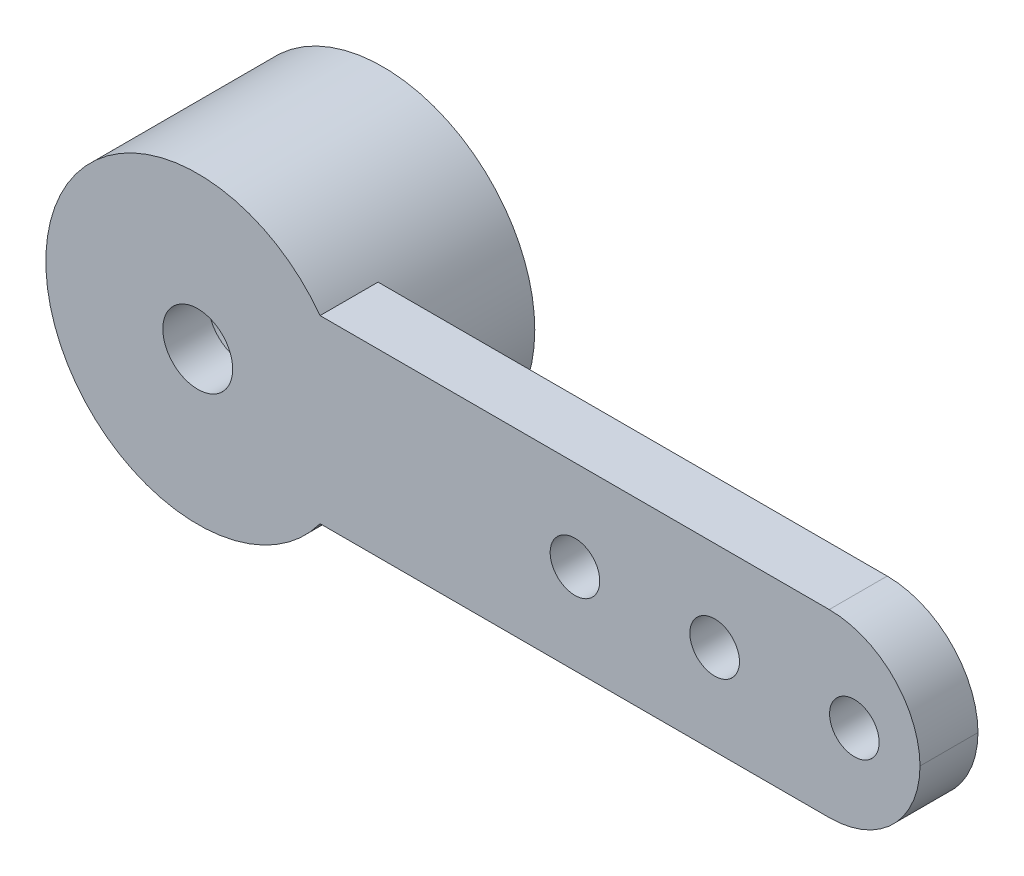
ISO-10303-21;
HEADER;
FILE_DESCRIPTION(('STEP AP214'),'2;1');
FILE_NAME('part.step','',(''),(''),'','','');
FILE_SCHEMA(('AUTOMOTIVE_DESIGN { 1 0 10303 214 1 1 1 1 }'));
ENDSEC;
DATA;
#1=APPLICATION_CONTEXT('core data for automotive mechanical design processes');
#2=APPLICATION_PROTOCOL_DEFINITION('international standard','automotive_design',2000,#1);
#3=PRODUCT_CONTEXT('',#1,'mechanical');
#4=PRODUCT('Part','Part','',(#3));
#5=PRODUCT_RELATED_PRODUCT_CATEGORY('part','',(#4));
#6=PRODUCT_DEFINITION_FORMATION('','',#4);
#7=PRODUCT_DEFINITION_CONTEXT('part definition',#1,'design');
#8=PRODUCT_DEFINITION('design','',#6,#7);
#9=PRODUCT_DEFINITION_SHAPE('','',#8);
#10=(LENGTH_UNIT() NAMED_UNIT(*) SI_UNIT(.MILLI.,.METRE.));
#11=(NAMED_UNIT(*) PLANE_ANGLE_UNIT() SI_UNIT($,.RADIAN.));
#12=(NAMED_UNIT(*) SI_UNIT($,.STERADIAN.) SOLID_ANGLE_UNIT());
#13=UNCERTAINTY_MEASURE_WITH_UNIT(LENGTH_MEASURE(1.E-05),#10,'distance_accuracy_value','');
#14=(GEOMETRIC_REPRESENTATION_CONTEXT(3) GLOBAL_UNCERTAINTY_ASSIGNED_CONTEXT((#13)) GLOBAL_UNIT_ASSIGNED_CONTEXT((#10,
#11,#12)) REPRESENTATION_CONTEXT('',''));
#15=CARTESIAN_POINT('',(0.,0.,0.));
#16=DIRECTION('',(0.,0.,1.));
#17=DIRECTION('',(1.,0.,0.));
#18=AXIS2_PLACEMENT_3D('',#15,#16,#17);
#19=CARTESIAN_POINT('',(0.,0.,3.3655));
#20=DIRECTION('',(0.,0.,-1.));
#21=DIRECTION('',(-1.,0.,0.));
#22=AXIS2_PLACEMENT_3D('',#19,#20,#21);
#23=CYLINDRICAL_SURFACE('',#22,2.76225);
#24=CARTESIAN_POINT('',(0.,0.,3.3655));
#25=DIRECTION('',(0.,0.,1.));
#26=DIRECTION('',(1.,0.,0.));
#27=AXIS2_PLACEMENT_3D('',#24,#25,#26);
#28=CIRCLE('',#27,2.76225);
#29=CARTESIAN_POINT('',(2.22396002043652,1.6383,3.3655));
#30=VERTEX_POINT('',#29);
#31=CARTESIAN_POINT('',(2.22396002043652,-1.6383,3.3655));
#32=VERTEX_POINT('',#31);
#33=EDGE_CURVE('E101',#30,#32,#28,.T.);
#34=ORIENTED_EDGE('',*,*,#33,.F.);
#35=DIRECTION('',(0.,0.,-1.));
#36=VECTOR('',#35,1.);
#37=CARTESIAN_POINT('',(2.22396002043652,1.6383,3.3655));
#38=LINE('',#37,#36);
#39=CARTESIAN_POINT('',(2.22396002043652,1.6383,2.3114));
#40=VERTEX_POINT('',#39);
#41=EDGE_CURVE('E104',#30,#40,#38,.T.);
#42=ORIENTED_EDGE('',*,*,#41,.T.);
#43=CARTESIAN_POINT('',(0.,0.,2.3114));
#44=DIRECTION('',(0.,0.,1.));
#45=DIRECTION('',(1.,0.,0.));
#46=AXIS2_PLACEMENT_3D('',#43,#44,#45);
#47=CIRCLE('',#46,2.76225);
#48=CARTESIAN_POINT('',(2.22396002043652,-1.6383,2.3114));
#49=VERTEX_POINT('',#48);
#50=EDGE_CURVE('E103',#49,#40,#47,.T.);
#51=ORIENTED_EDGE('',*,*,#50,.F.);
#52=DIRECTION('',(0.,0.,-1.));
#53=VECTOR('',#52,1.);
#54=CARTESIAN_POINT('',(2.22396002043652,-1.6383,3.3655));
#55=LINE('',#54,#53);
#56=EDGE_CURVE('E87',#49,#32,#55,.F.);
#57=ORIENTED_EDGE('',*,*,#56,.T.);
#58=EDGE_LOOP('',(#34,#42,#51,#57));
#59=FACE_BOUND('',#58,.T.);
#60=CARTESIAN_POINT('',(0.,0.,0.));
#61=DIRECTION('',(0.,0.,1.));
#62=DIRECTION('',(1.,0.,0.));
#63=AXIS2_PLACEMENT_3D('',#60,#61,#62);
#64=CIRCLE('',#63,2.76225);
#65=CARTESIAN_POINT('',(2.76225,0.,0.));
#66=VERTEX_POINT('',#65);
#67=EDGE_CURVE('E109',#66,#66,#64,.T.);
#68=ORIENTED_EDGE('',*,*,#67,.T.);
#69=EDGE_LOOP('',(#68));
#70=FACE_BOUND('',#69,.T.);
#71=ADVANCED_FACE('F35',(#59,#70),#23,.T.);
#72=CARTESIAN_POINT('',(0.,0.,3.3655));
#73=DIRECTION('',(0.,0.,1.));
#74=DIRECTION('',(1.,0.,0.));
#75=AXIS2_PLACEMENT_3D('',#72,#73,#74);
#76=PLANE('',#75);
#77=CARTESIAN_POINT('',(11.938,0.,3.3655));
#78=DIRECTION('',(0.,0.,1.));
#79=DIRECTION('',(1.,0.,0.));
#80=AXIS2_PLACEMENT_3D('',#77,#78,#79);
#81=CIRCLE('',#80,0.450849999999999);
#82=CARTESIAN_POINT('',(12.38885,0.,3.3655));
#83=VERTEX_POINT('',#82);
#84=EDGE_CURVE('E146',#83,#83,#81,.T.);
#85=ORIENTED_EDGE('',*,*,#84,.F.);
#86=EDGE_LOOP('',(#85));
#87=FACE_BOUND('',#86,.T.);
#88=CARTESIAN_POINT('',(9.398,0.,3.3655));
#89=DIRECTION('',(0.,0.,1.));
#90=DIRECTION('',(1.,0.,0.));
#91=AXIS2_PLACEMENT_3D('',#88,#89,#90);
#92=CIRCLE('',#91,0.450849999999999);
#93=CARTESIAN_POINT('',(9.84885,0.,3.3655));
#94=VERTEX_POINT('',#93);
#95=EDGE_CURVE('E136',#94,#94,#92,.T.);
#96=ORIENTED_EDGE('',*,*,#95,.F.);
#97=EDGE_LOOP('',(#96));
#98=FACE_BOUND('',#97,.T.);
#99=CARTESIAN_POINT('',(6.858,0.,3.3655));
#100=DIRECTION('',(0.,0.,1.));
#101=DIRECTION('',(1.,0.,0.));
#102=AXIS2_PLACEMENT_3D('',#99,#100,#101);
#103=CIRCLE('',#102,0.45085);
#104=CARTESIAN_POINT('',(7.30885,0.,3.3655));
#105=VERTEX_POINT('',#104);
#106=EDGE_CURVE('E133',#105,#105,#103,.T.);
#107=ORIENTED_EDGE('',*,*,#106,.F.);
#108=EDGE_LOOP('',(#107));
#109=FACE_BOUND('',#108,.T.);
#110=CARTESIAN_POINT('',(0.,0.,3.3655));
#111=DIRECTION('',(0.,0.,1.));
#112=DIRECTION('',(1.,0.,0.));
#113=AXIS2_PLACEMENT_3D('',#110,#111,#112);
#114=CIRCLE('',#113,0.635);
#115=CARTESIAN_POINT('',(0.635,0.,3.3655));
#116=VERTEX_POINT('',#115);
#117=EDGE_CURVE('E125',#116,#116,#114,.T.);
#118=ORIENTED_EDGE('',*,*,#117,.F.);
#119=EDGE_LOOP('',(#118));
#120=FACE_BOUND('',#119,.T.);
#121=DIRECTION('',(1.,0.,0.));
#122=VECTOR('',#121,1.);
#123=CARTESIAN_POINT('',(0.,-1.6383,3.3655));
#124=LINE('',#123,#122);
#125=CARTESIAN_POINT('',(11.4808,-1.6383,3.3655));
#126=VERTEX_POINT('',#125);
#127=EDGE_CURVE('E83',#32,#126,#124,.T.);
#128=ORIENTED_EDGE('',*,*,#127,.T.);
#129=CARTESIAN_POINT('',(11.4808,0.0126999999999998,3.3655));
#130=DIRECTION('',(0.,0.,1.));
#131=DIRECTION('',(1.,0.,0.));
#132=AXIS2_PLACEMENT_3D('',#129,#130,#131);
#133=CIRCLE('',#132,1.651);
#134=CARTESIAN_POINT('',(13.1317511531236,1.1276380220207E-13,3.3655));
#135=VERTEX_POINT('',#134);
#136=EDGE_CURVE('E119',#126,#135,#133,.T.);
#137=ORIENTED_EDGE('',*,*,#136,.T.);
#138=CARTESIAN_POINT('',(11.4808,-0.0126999999999998,3.3655));
#139=DIRECTION('',(0.,0.,1.));
#140=DIRECTION('',(1.,0.,0.));
#141=AXIS2_PLACEMENT_3D('',#138,#139,#140);
#142=CIRCLE('',#141,1.651);
#143=CARTESIAN_POINT('',(11.4808,1.6383,3.3655));
#144=VERTEX_POINT('',#143);
#145=EDGE_CURVE('E117',#135,#144,#142,.T.);
#146=ORIENTED_EDGE('',*,*,#145,.T.);
#147=DIRECTION('',(-1.,0.,0.));
#148=VECTOR('',#147,1.);
#149=CARTESIAN_POINT('',(0.,1.6383,3.3655));
#150=LINE('',#149,#148);
#151=EDGE_CURVE('E93',#144,#30,#150,.T.);
#152=ORIENTED_EDGE('',*,*,#151,.T.);
#153=ORIENTED_EDGE('',*,*,#33,.T.);
#154=EDGE_LOOP('',(#128,#137,#146,#152,#153));
#155=FACE_BOUND('',#154,.T.);
#156=ADVANCED_FACE('F107',(#87,#98,#109,#120,#155),#76,.T.);
#157=CARTESIAN_POINT('',(0.,0.,0.));
#158=DIRECTION('',(0.,0.,1.));
#159=DIRECTION('',(1.,0.,0.));
#160=AXIS2_PLACEMENT_3D('',#157,#158,#159);
#161=PLANE('',#160);
#162=CARTESIAN_POINT('',(0.,0.,0.));
#163=DIRECTION('',(0.,0.,-1.));
#164=DIRECTION('',(-1.,0.,0.));
#165=AXIS2_PLACEMENT_3D('',#162,#163,#164);
#166=CIRCLE('',#165,1.49225);
#167=CARTESIAN_POINT('',(-1.49225,0.,0.));
#168=VERTEX_POINT('',#167);
#169=EDGE_CURVE('E132',#168,#168,#166,.T.);
#170=ORIENTED_EDGE('',*,*,#169,.F.);
#171=EDGE_LOOP('',(#170));
#172=FACE_BOUND('',#171,.T.);
#173=ORIENTED_EDGE('',*,*,#67,.F.);
#174=EDGE_LOOP('',(#173));
#175=FACE_BOUND('',#174,.T.);
#176=ADVANCED_FACE('F177',(#172,#175),#161,.F.);
#177=CARTESIAN_POINT('',(0.,0.,2.3114));
#178=DIRECTION('',(0.,0.,1.));
#179=DIRECTION('',(1.,0.,0.));
#180=AXIS2_PLACEMENT_3D('',#177,#178,#179);
#181=PLANE('',#180);
#182=CARTESIAN_POINT('',(11.938,0.,2.3114));
#183=DIRECTION('',(0.,0.,1.));
#184=DIRECTION('',(1.,0.,0.));
#185=AXIS2_PLACEMENT_3D('',#182,#183,#184);
#186=CIRCLE('',#185,0.450849999999999);
#187=CARTESIAN_POINT('',(12.38885,0.,2.3114));
#188=VERTEX_POINT('',#187);
#189=EDGE_CURVE('E39',#188,#188,#186,.T.);
#190=ORIENTED_EDGE('',*,*,#189,.T.);
#191=EDGE_LOOP('',(#190));
#192=FACE_BOUND('',#191,.T.);
#193=CARTESIAN_POINT('',(9.398,0.,2.3114));
#194=DIRECTION('',(0.,0.,1.));
#195=DIRECTION('',(1.,0.,0.));
#196=AXIS2_PLACEMENT_3D('',#193,#194,#195);
#197=CIRCLE('',#196,0.450849999999999);
#198=CARTESIAN_POINT('',(9.84885,0.,2.3114));
#199=VERTEX_POINT('',#198);
#200=EDGE_CURVE('E134',#199,#199,#197,.T.);
#201=ORIENTED_EDGE('',*,*,#200,.T.);
#202=EDGE_LOOP('',(#201));
#203=FACE_BOUND('',#202,.T.);
#204=CARTESIAN_POINT('',(6.858,0.,2.3114));
#205=DIRECTION('',(0.,0.,1.));
#206=DIRECTION('',(1.,0.,0.));
#207=AXIS2_PLACEMENT_3D('',#204,#205,#206);
#208=CIRCLE('',#207,0.45085);
#209=CARTESIAN_POINT('',(7.30885,0.,2.3114));
#210=VERTEX_POINT('',#209);
#211=EDGE_CURVE('E130',#210,#210,#208,.T.);
#212=ORIENTED_EDGE('',*,*,#211,.T.);
#213=EDGE_LOOP('',(#212));
#214=FACE_BOUND('',#213,.T.);
#215=CARTESIAN_POINT('',(11.4808,-0.0126999999999998,2.3114));
#216=DIRECTION('',(0.,0.,1.));
#217=DIRECTION('',(1.,0.,0.));
#218=AXIS2_PLACEMENT_3D('',#215,#216,#217);
#219=CIRCLE('',#218,1.651);
#220=CARTESIAN_POINT('',(11.4808,1.6383,2.3114));
#221=VERTEX_POINT('',#220);
#222=CARTESIAN_POINT('',(13.1317511531236,1.1276380220207E-13,2.3114));
#223=VERTEX_POINT('',#222);
#224=EDGE_CURVE('E52',#221,#223,#219,.F.);
#225=ORIENTED_EDGE('',*,*,#224,.T.);
#226=CARTESIAN_POINT('',(11.4808,0.0126999999999998,2.3114));
#227=DIRECTION('',(0.,0.,1.));
#228=DIRECTION('',(1.,0.,0.));
#229=AXIS2_PLACEMENT_3D('',#226,#227,#228);
#230=CIRCLE('',#229,1.651);
#231=CARTESIAN_POINT('',(11.4808,-1.6383,2.3114));
#232=VERTEX_POINT('',#231);
#233=EDGE_CURVE('E44',#223,#232,#230,.F.);
#234=ORIENTED_EDGE('',*,*,#233,.T.);
#235=DIRECTION('',(1.,0.,0.));
#236=VECTOR('',#235,1.);
#237=CARTESIAN_POINT('',(0.,-1.6383,2.3114));
#238=LINE('',#237,#236);
#239=EDGE_CURVE('E155',#49,#232,#238,.T.);
#240=ORIENTED_EDGE('',*,*,#239,.F.);
#241=ORIENTED_EDGE('',*,*,#50,.T.);
#242=DIRECTION('',(-1.,0.,0.));
#243=VECTOR('',#242,1.);
#244=CARTESIAN_POINT('',(0.,1.6383,2.3114));
#245=LINE('',#244,#243);
#246=EDGE_CURVE('E105',#221,#40,#245,.T.);
#247=ORIENTED_EDGE('',*,*,#246,.F.);
#248=EDGE_LOOP('',(#225,#234,#240,#241,#247));
#249=FACE_BOUND('',#248,.T.);
#250=ADVANCED_FACE('F159',(#192,#203,#214,#249),#181,.F.);
#251=CARTESIAN_POINT('',(0.,1.6383,2.3114));
#252=DIRECTION('',(0.,1.,0.));
#253=DIRECTION('',(0.,0.,1.));
#254=AXIS2_PLACEMENT_3D('',#251,#252,#253);
#255=PLANE('',#254);
#256=ORIENTED_EDGE('',*,*,#151,.F.);
#257=DIRECTION('',(0.,0.,1.));
#258=VECTOR('',#257,1.);
#259=CARTESIAN_POINT('',(11.4808,1.6383,2.3114));
#260=LINE('',#259,#258);
#261=EDGE_CURVE('E12',#144,#221,#260,.F.);
#262=ORIENTED_EDGE('',*,*,#261,.T.);
#263=ORIENTED_EDGE('',*,*,#246,.T.);
#264=ORIENTED_EDGE('',*,*,#41,.F.);
#265=EDGE_LOOP('',(#256,#262,#263,#264));
#266=FACE_BOUND('',#265,.T.);
#267=ADVANCED_FACE('F158',(#266),#255,.T.);
#268=CARTESIAN_POINT('',(0.,-1.6383,2.3114));
#269=DIRECTION('',(0.,-1.,0.));
#270=DIRECTION('',(0.,0.,-1.));
#271=AXIS2_PLACEMENT_3D('',#268,#269,#270);
#272=PLANE('',#271);
#273=ORIENTED_EDGE('',*,*,#239,.T.);
#274=DIRECTION('',(0.,0.,1.));
#275=VECTOR('',#274,1.);
#276=CARTESIAN_POINT('',(11.4808,-1.6383,2.3114));
#277=LINE('',#276,#275);
#278=EDGE_CURVE('E90',#232,#126,#277,.T.);
#279=ORIENTED_EDGE('',*,*,#278,.T.);
#280=ORIENTED_EDGE('',*,*,#127,.F.);
#281=ORIENTED_EDGE('',*,*,#56,.F.);
#282=EDGE_LOOP('',(#273,#279,#280,#281));
#283=FACE_BOUND('',#282,.T.);
#284=ADVANCED_FACE('F86',(#283),#272,.T.);
#285=CARTESIAN_POINT('',(11.4808,-0.0126999999999998,2.3114));
#286=DIRECTION('',(0.,0.,1.));
#287=DIRECTION('',(1.,0.,0.));
#288=AXIS2_PLACEMENT_3D('',#285,#286,#287);
#289=CYLINDRICAL_SURFACE('',#288,1.651);
#290=DIRECTION('',(0.,0.,1.));
#291=VECTOR('',#290,1.);
#292=CARTESIAN_POINT('',(13.1317511531236,1.1276719033386E-13,2.83845));
#293=LINE('',#292,#291);
#294=EDGE_CURVE('E94',#223,#135,#293,.T.);
#295=ORIENTED_EDGE('',*,*,#294,.F.);
#296=ORIENTED_EDGE('',*,*,#224,.F.);
#297=ORIENTED_EDGE('',*,*,#261,.F.);
#298=ORIENTED_EDGE('',*,*,#145,.F.);
#299=EDGE_LOOP('',(#295,#296,#297,#298));
#300=FACE_BOUND('',#299,.T.);
#301=ADVANCED_FACE('F37',(#300),#289,.T.);
#302=CARTESIAN_POINT('',(11.4808,0.0126999999999998,2.3114));
#303=DIRECTION('',(0.,0.,1.));
#304=DIRECTION('',(1.,0.,0.));
#305=AXIS2_PLACEMENT_3D('',#302,#303,#304);
#306=CYLINDRICAL_SURFACE('',#305,1.651);
#307=ORIENTED_EDGE('',*,*,#233,.F.);
#308=ORIENTED_EDGE('',*,*,#294,.T.);
#309=ORIENTED_EDGE('',*,*,#136,.F.);
#310=ORIENTED_EDGE('',*,*,#278,.F.);
#311=EDGE_LOOP('',(#307,#308,#309,#310));
#312=FACE_BOUND('',#311,.T.);
#313=ADVANCED_FACE('F162',(#312),#306,.T.);
#314=CARTESIAN_POINT('',(0.,0.,-1.79605122421383));
#315=DIRECTION('',(0.,0.,1.));
#316=DIRECTION('',(1.,0.,0.));
#317=AXIS2_PLACEMENT_3D('',#314,#315,#316);
#318=CYLINDRICAL_SURFACE('',#317,0.635);
#319=CARTESIAN_POINT('',(0.,0.,2.54));
#320=DIRECTION('',(0.,0.,1.));
#321=DIRECTION('',(1.,0.,0.));
#322=AXIS2_PLACEMENT_3D('',#319,#320,#321);
#323=CIRCLE('',#322,0.635);
#324=CARTESIAN_POINT('',(0.635,0.,2.54));
#325=VERTEX_POINT('',#324);
#326=EDGE_CURVE('E126',#325,#325,#323,.F.);
#327=ORIENTED_EDGE('',*,*,#326,.T.);
#328=EDGE_LOOP('',(#327));
#329=FACE_BOUND('',#328,.T.);
#330=ORIENTED_EDGE('',*,*,#117,.T.);
#331=EDGE_LOOP('',(#330));
#332=FACE_BOUND('',#331,.T.);
#333=ADVANCED_FACE('F170',(#329,#332),#318,.F.);
#334=CARTESIAN_POINT('',(0.,0.,2.54));
#335=DIRECTION('',(0.,0.,1.));
#336=DIRECTION('',(1.,0.,0.));
#337=AXIS2_PLACEMENT_3D('',#334,#335,#336);
#338=PLANE('',#337);
#339=CARTESIAN_POINT('',(0.,0.,2.54));
#340=DIRECTION('',(0.,0.,1.));
#341=DIRECTION('',(1.,0.,0.));
#342=AXIS2_PLACEMENT_3D('',#339,#340,#341);
#343=CIRCLE('',#342,1.49225);
#344=CARTESIAN_POINT('',(1.49225,0.,2.54));
#345=VERTEX_POINT('',#344);
#346=EDGE_CURVE('E129',#345,#345,#343,.F.);
#347=ORIENTED_EDGE('',*,*,#346,.T.);
#348=EDGE_LOOP('',(#347));
#349=FACE_BOUND('',#348,.T.);
#350=ORIENTED_EDGE('',*,*,#326,.F.);
#351=EDGE_LOOP('',(#350));
#352=FACE_BOUND('',#351,.T.);
#353=ADVANCED_FACE('F191',(#349,#352),#338,.F.);
#354=CARTESIAN_POINT('',(0.,0.,9.3007203769025));
#355=DIRECTION('',(0.,0.,-1.));
#356=DIRECTION('',(-1.,0.,0.));
#357=AXIS2_PLACEMENT_3D('',#354,#355,#356);
#358=CYLINDRICAL_SURFACE('',#357,1.49225);
#359=ORIENTED_EDGE('',*,*,#169,.T.);
#360=EDGE_LOOP('',(#359));
#361=FACE_BOUND('',#360,.T.);
#362=ORIENTED_EDGE('',*,*,#346,.F.);
#363=EDGE_LOOP('',(#362));
#364=FACE_BOUND('',#363,.T.);
#365=ADVANCED_FACE('F195',(#361,#364),#358,.F.);
#366=CARTESIAN_POINT('',(6.858,0.,0.));
#367=DIRECTION('',(0.,0.,1.));
#368=DIRECTION('',(1.,0.,0.));
#369=AXIS2_PLACEMENT_3D('',#366,#367,#368);
#370=CYLINDRICAL_SURFACE('',#369,0.45085);
#371=ORIENTED_EDGE('',*,*,#106,.T.);
#372=EDGE_LOOP('',(#371));
#373=FACE_BOUND('',#372,.T.);
#374=ORIENTED_EDGE('',*,*,#211,.F.);
#375=EDGE_LOOP('',(#374));
#376=FACE_BOUND('',#375,.T.);
#377=ADVANCED_FACE('F199',(#373,#376),#370,.F.);
#378=CARTESIAN_POINT('',(9.398,0.,0.));
#379=DIRECTION('',(0.,0.,1.));
#380=DIRECTION('',(1.,0.,0.));
#381=AXIS2_PLACEMENT_3D('',#378,#379,#380);
#382=CYLINDRICAL_SURFACE('',#381,0.450849999999999);
#383=ORIENTED_EDGE('',*,*,#95,.T.);
#384=EDGE_LOOP('',(#383));
#385=FACE_BOUND('',#384,.T.);
#386=ORIENTED_EDGE('',*,*,#200,.F.);
#387=EDGE_LOOP('',(#386));
#388=FACE_BOUND('',#387,.T.);
#389=ADVANCED_FACE('F203',(#385,#388),#382,.F.);
#390=CARTESIAN_POINT('',(11.938,0.,0.));
#391=DIRECTION('',(0.,0.,1.));
#392=DIRECTION('',(1.,0.,0.));
#393=AXIS2_PLACEMENT_3D('',#390,#391,#392);
#394=CYLINDRICAL_SURFACE('',#393,0.450849999999999);
#395=ORIENTED_EDGE('',*,*,#84,.T.);
#396=EDGE_LOOP('',(#395));
#397=FACE_BOUND('',#396,.T.);
#398=ORIENTED_EDGE('',*,*,#189,.F.);
#399=EDGE_LOOP('',(#398));
#400=FACE_BOUND('',#399,.T.);
#401=ADVANCED_FACE('F207',(#397,#400),#394,.F.);
#402=CLOSED_SHELL('',(#71,#156,#176,#250,#267,#284,#301,#313,#333,#353,#365,#377,#389,#401));
#403=MANIFOLD_SOLID_BREP('B2',#402);
#404=ADVANCED_BREP_SHAPE_REPRESENTATION('',(#18,#403),#14);
#405=SHAPE_DEFINITION_REPRESENTATION(#9,#404);
ENDSEC;
END-ISO-10303-21;
